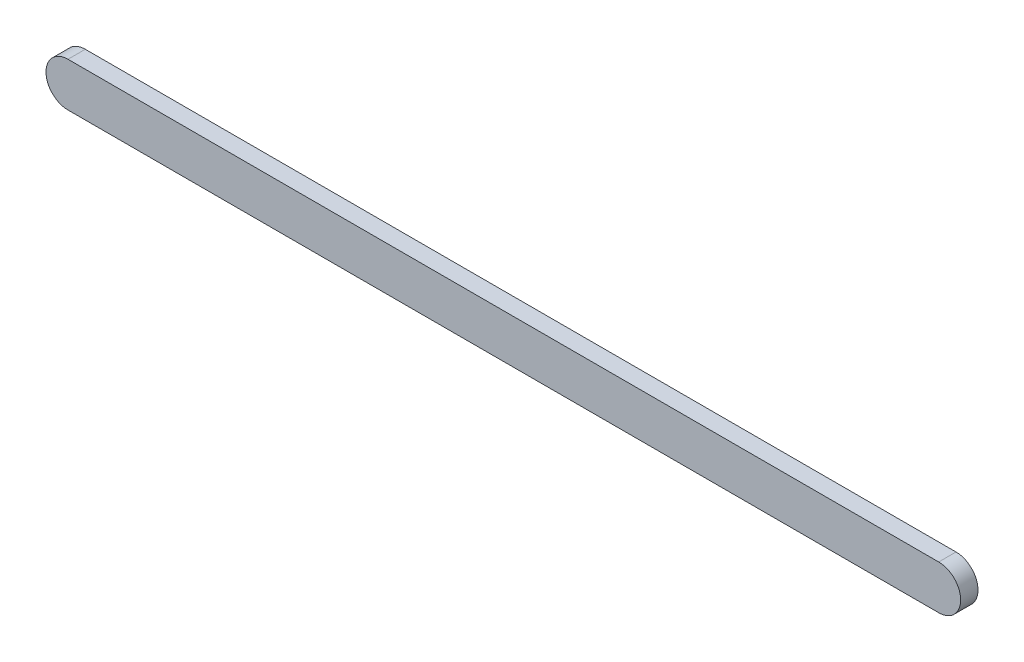
ISO-10303-21;
HEADER;
FILE_DESCRIPTION(('STEP AP214'),'2;1');
FILE_NAME('part.step','',(''),(''),'','','');
FILE_SCHEMA(('AUTOMOTIVE_DESIGN { 1 0 10303 214 1 1 1 1 }'));
ENDSEC;
DATA;
#1=APPLICATION_CONTEXT('core data for automotive mechanical design processes');
#2=APPLICATION_PROTOCOL_DEFINITION('international standard','automotive_design',2000,#1);
#3=PRODUCT_CONTEXT('',#1,'mechanical');
#4=PRODUCT('Part','Part','',(#3));
#5=PRODUCT_RELATED_PRODUCT_CATEGORY('part','',(#4));
#6=PRODUCT_DEFINITION_FORMATION('','',#4);
#7=PRODUCT_DEFINITION_CONTEXT('part definition',#1,'design');
#8=PRODUCT_DEFINITION('design','',#6,#7);
#9=PRODUCT_DEFINITION_SHAPE('','',#8);
#10=(LENGTH_UNIT() NAMED_UNIT(*) SI_UNIT(.MILLI.,.METRE.));
#11=(NAMED_UNIT(*) PLANE_ANGLE_UNIT() SI_UNIT($,.RADIAN.));
#12=(NAMED_UNIT(*) SI_UNIT($,.STERADIAN.) SOLID_ANGLE_UNIT());
#13=UNCERTAINTY_MEASURE_WITH_UNIT(LENGTH_MEASURE(1.E-05),#10,'distance_accuracy_value','');
#14=(GEOMETRIC_REPRESENTATION_CONTEXT(3) GLOBAL_UNCERTAINTY_ASSIGNED_CONTEXT((#13)) GLOBAL_UNIT_ASSIGNED_CONTEXT((#10,
#11,#12)) REPRESENTATION_CONTEXT('',''));
#15=CARTESIAN_POINT('',(0.,0.,0.));
#16=DIRECTION('',(0.,0.,1.));
#17=DIRECTION('',(1.,0.,0.));
#18=AXIS2_PLACEMENT_3D('',#15,#16,#17);
#19=CARTESIAN_POINT('',(140.8684,119.5832,0.));
#20=DIRECTION('',(0.,1.,0.));
#21=DIRECTION('',(1.,0.,0.));
#22=AXIS2_PLACEMENT_3D('',#19,#20,#21);
#23=PLANE('',#22);
#24=DIRECTION('',(1.,0.,0.));
#25=VECTOR('',#24,1.);
#26=CARTESIAN_POINT('',(140.8684,119.5832,0.1999996));
#27=LINE('',#26,#25);
#28=CARTESIAN_POINT('',(140.8684,119.5832,0.1999996));
#29=VERTEX_POINT('',#28);
#30=CARTESIAN_POINT('',(150.9268,119.5832,0.1999996));
#31=VERTEX_POINT('',#30);
#32=EDGE_CURVE('E11',#29,#31,#27,.T.);
#33=ORIENTED_EDGE('',*,*,#32,.F.);
#34=DIRECTION('',(0.,0.,1.));
#35=VECTOR('',#34,1.);
#36=CARTESIAN_POINT('',(140.8684,119.5832,0.));
#37=LINE('',#36,#35);
#38=CARTESIAN_POINT('',(140.8684,119.5832,0.));
#39=VERTEX_POINT('',#38);
#40=EDGE_CURVE('E24',#39,#29,#37,.T.);
#41=ORIENTED_EDGE('',*,*,#40,.F.);
#42=DIRECTION('',(1.,0.,0.));
#43=VECTOR('',#42,1.);
#44=CARTESIAN_POINT('',(140.8684,119.5832,0.));
#45=LINE('',#44,#43);
#46=CARTESIAN_POINT('',(150.9268,119.5832,0.));
#47=VERTEX_POINT('',#46);
#48=EDGE_CURVE('E75',#39,#47,#45,.T.);
#49=ORIENTED_EDGE('',*,*,#48,.T.);
#50=DIRECTION('',(0.,0.,1.));
#51=VECTOR('',#50,1.);
#52=CARTESIAN_POINT('',(150.9268,119.5832,0.));
#53=LINE('',#52,#51);
#54=EDGE_CURVE('E37',#47,#31,#53,.T.);
#55=ORIENTED_EDGE('',*,*,#54,.T.);
#56=EDGE_LOOP('',(#33,#41,#49,#55));
#57=FACE_BOUND('',#56,.T.);
#58=ADVANCED_FACE('F17',(#57),#23,.F.);
#59=CARTESIAN_POINT('',(150.9268,119.8372,0.));
#60=DIRECTION('',(0.,0.,-1.));
#61=DIRECTION('',(-1.11896493820492E-13,-1.,0.));
#62=AXIS2_PLACEMENT_3D('',#59,#60,#61);
#63=CYLINDRICAL_SURFACE('',#62,0.253999999999995);
#64=CARTESIAN_POINT('',(150.9268,119.8372,0.1999996));
#65=DIRECTION('',(0.,0.,1.));
#66=DIRECTION('',(-1.11896493820492E-13,-1.,0.));
#67=AXIS2_PLACEMENT_3D('',#64,#65,#66);
#68=CIRCLE('',#67,0.253999999999995);
#69=CARTESIAN_POINT('',(150.9268,120.0912,0.1999996));
#70=VERTEX_POINT('',#69);
#71=EDGE_CURVE('E83',#31,#70,#68,.T.);
#72=ORIENTED_EDGE('',*,*,#71,.F.);
#73=ORIENTED_EDGE('',*,*,#54,.F.);
#74=CARTESIAN_POINT('',(150.9268,119.8372,0.));
#75=DIRECTION('',(0.,0.,1.));
#76=DIRECTION('',(-1.11896493820492E-13,-1.,0.));
#77=AXIS2_PLACEMENT_3D('',#74,#75,#76);
#78=CIRCLE('',#77,0.253999999999995);
#79=CARTESIAN_POINT('',(150.9268,120.0912,0.));
#80=VERTEX_POINT('',#79);
#81=EDGE_CURVE('E81',#47,#80,#78,.T.);
#82=ORIENTED_EDGE('',*,*,#81,.T.);
#83=DIRECTION('',(0.,0.,1.));
#84=VECTOR('',#83,1.);
#85=CARTESIAN_POINT('',(150.9268,120.0912,0.));
#86=LINE('',#85,#84);
#87=EDGE_CURVE('E67',#80,#70,#86,.T.);
#88=ORIENTED_EDGE('',*,*,#87,.T.);
#89=EDGE_LOOP('',(#72,#73,#82,#88));
#90=FACE_BOUND('',#89,.T.);
#91=ADVANCED_FACE('F89',(#90),#63,.T.);
#92=CARTESIAN_POINT('',(150.9268,120.0912,0.));
#93=DIRECTION('',(0.,-1.,0.));
#94=DIRECTION('',(-1.,0.,0.));
#95=AXIS2_PLACEMENT_3D('',#92,#93,#94);
#96=PLANE('',#95);
#97=DIRECTION('',(-1.,0.,0.));
#98=VECTOR('',#97,1.);
#99=CARTESIAN_POINT('',(150.9268,120.0912,0.1999996));
#100=LINE('',#99,#98);
#101=CARTESIAN_POINT('',(140.8684,120.0912,0.1999996));
#102=VERTEX_POINT('',#101);
#103=EDGE_CURVE('E71',#70,#102,#100,.T.);
#104=ORIENTED_EDGE('',*,*,#103,.F.);
#105=ORIENTED_EDGE('',*,*,#87,.F.);
#106=DIRECTION('',(-1.,0.,0.));
#107=VECTOR('',#106,1.);
#108=CARTESIAN_POINT('',(150.9268,120.0912,0.));
#109=LINE('',#108,#107);
#110=CARTESIAN_POINT('',(140.8684,120.0912,0.));
#111=VERTEX_POINT('',#110);
#112=EDGE_CURVE('E63',#80,#111,#109,.T.);
#113=ORIENTED_EDGE('',*,*,#112,.T.);
#114=DIRECTION('',(0.,0.,1.));
#115=VECTOR('',#114,1.);
#116=CARTESIAN_POINT('',(140.8684,120.0912,0.));
#117=LINE('',#116,#115);
#118=EDGE_CURVE('E53',#111,#102,#117,.T.);
#119=ORIENTED_EDGE('',*,*,#118,.T.);
#120=EDGE_LOOP('',(#104,#105,#113,#119));
#121=FACE_BOUND('',#120,.T.);
#122=ADVANCED_FACE('F66',(#121),#96,.F.);
#123=CARTESIAN_POINT('',(140.8684,119.8372,0.));
#124=DIRECTION('',(0.,0.,-1.));
#125=DIRECTION('',(1.11896493820492E-13,1.,0.));
#126=AXIS2_PLACEMENT_3D('',#123,#124,#125);
#127=CYLINDRICAL_SURFACE('',#126,0.253999999999995);
#128=CARTESIAN_POINT('',(140.8684,119.8372,0.1999996));
#129=DIRECTION('',(0.,0.,1.));
#130=DIRECTION('',(1.11896493820492E-13,1.,0.));
#131=AXIS2_PLACEMENT_3D('',#128,#129,#130);
#132=CIRCLE('',#131,0.253999999999995);
#133=EDGE_CURVE('E59',#102,#29,#132,.T.);
#134=ORIENTED_EDGE('',*,*,#133,.F.);
#135=ORIENTED_EDGE('',*,*,#118,.F.);
#136=CARTESIAN_POINT('',(140.8684,119.8372,0.));
#137=DIRECTION('',(0.,0.,1.));
#138=DIRECTION('',(1.11896493820492E-13,1.,0.));
#139=AXIS2_PLACEMENT_3D('',#136,#137,#138);
#140=CIRCLE('',#139,0.253999999999995);
#141=EDGE_CURVE('E57',#111,#39,#140,.T.);
#142=ORIENTED_EDGE('',*,*,#141,.T.);
#143=ORIENTED_EDGE('',*,*,#40,.T.);
#144=EDGE_LOOP('',(#134,#135,#142,#143));
#145=FACE_BOUND('',#144,.T.);
#146=ADVANCED_FACE('F55',(#145),#127,.T.);
#147=CARTESIAN_POINT('',(140.8684,119.5832,0.));
#148=DIRECTION('',(0.,0.,-1.));
#149=DIRECTION('',(-1.,0.,0.));
#150=AXIS2_PLACEMENT_3D('',#147,#148,#149);
#151=PLANE('',#150);
#152=ORIENTED_EDGE('',*,*,#141,.F.);
#153=ORIENTED_EDGE('',*,*,#112,.F.);
#154=ORIENTED_EDGE('',*,*,#81,.F.);
#155=ORIENTED_EDGE('',*,*,#48,.F.);
#156=EDGE_LOOP('',(#152,#153,#154,#155));
#157=FACE_BOUND('',#156,.T.);
#158=ADVANCED_FACE('F74',(#157),#151,.T.);
#159=CARTESIAN_POINT('',(140.8684,119.5832,0.1999996));
#160=DIRECTION('',(0.,0.,-1.));
#161=DIRECTION('',(-1.,0.,0.));
#162=AXIS2_PLACEMENT_3D('',#159,#160,#161);
#163=PLANE('',#162);
#164=ORIENTED_EDGE('',*,*,#32,.T.);
#165=ORIENTED_EDGE('',*,*,#71,.T.);
#166=ORIENTED_EDGE('',*,*,#103,.T.);
#167=ORIENTED_EDGE('',*,*,#133,.T.);
#168=EDGE_LOOP('',(#164,#165,#166,#167));
#169=FACE_BOUND('',#168,.T.);
#170=ADVANCED_FACE('F91',(#169),#163,.F.);
#171=CLOSED_SHELL('',(#58,#91,#122,#146,#158,#170));
#172=MANIFOLD_SOLID_BREP('B1',#171);
#173=ADVANCED_BREP_SHAPE_REPRESENTATION('',(#18,#172),#14);
#174=SHAPE_DEFINITION_REPRESENTATION(#9,#173);
ENDSEC;
END-ISO-10303-21;
